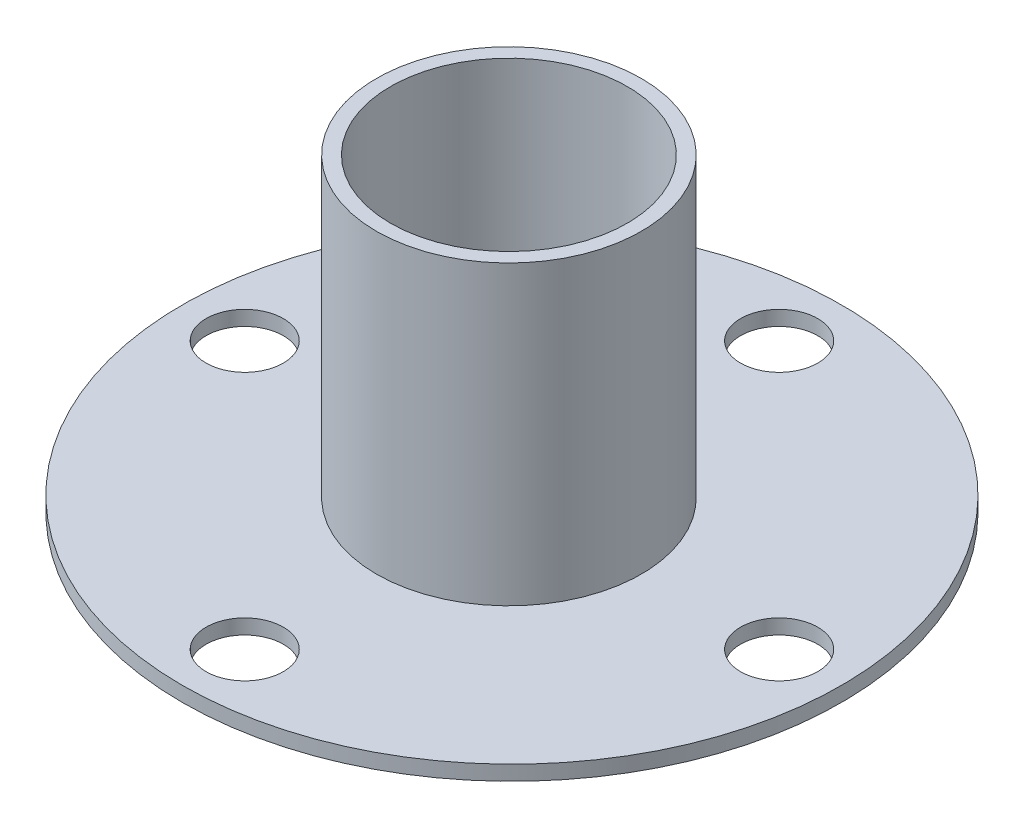
ISO-10303-21;
HEADER;
FILE_DESCRIPTION(('STEP AP214'),'2;1');
FILE_NAME('part.step','',(''),(''),'','','');
FILE_SCHEMA(('AUTOMOTIVE_DESIGN { 1 0 10303 214 1 1 1 1 }'));
ENDSEC;
DATA;
#1=APPLICATION_CONTEXT('core data for automotive mechanical design processes');
#2=APPLICATION_PROTOCOL_DEFINITION('international standard','automotive_design',2000,#1);
#3=PRODUCT_CONTEXT('',#1,'mechanical');
#4=PRODUCT('Part','Part','',(#3));
#5=PRODUCT_RELATED_PRODUCT_CATEGORY('part','',(#4));
#6=PRODUCT_DEFINITION_FORMATION('','',#4);
#7=PRODUCT_DEFINITION_CONTEXT('part definition',#1,'design');
#8=PRODUCT_DEFINITION('design','',#6,#7);
#9=PRODUCT_DEFINITION_SHAPE('','',#8);
#10=(LENGTH_UNIT() NAMED_UNIT(*) SI_UNIT(.MILLI.,.METRE.));
#11=(NAMED_UNIT(*) PLANE_ANGLE_UNIT() SI_UNIT($,.RADIAN.));
#12=(NAMED_UNIT(*) SI_UNIT($,.STERADIAN.) SOLID_ANGLE_UNIT());
#13=UNCERTAINTY_MEASURE_WITH_UNIT(LENGTH_MEASURE(1.E-05),#10,'distance_accuracy_value','');
#14=(GEOMETRIC_REPRESENTATION_CONTEXT(3) GLOBAL_UNCERTAINTY_ASSIGNED_CONTEXT((#13)) GLOBAL_UNIT_ASSIGNED_CONTEXT((#10,
#11,#12)) REPRESENTATION_CONTEXT('',''));
#15=CARTESIAN_POINT('',(0.,0.,0.));
#16=DIRECTION('',(0.,0.,1.));
#17=DIRECTION('',(1.,0.,0.));
#18=AXIS2_PLACEMENT_3D('',#15,#16,#17);
#19=CARTESIAN_POINT('',(6.52449997141957,44.,6.24759262427687));
#20=DIRECTION('',(0.,1.,0.));
#21=DIRECTION('',(0.,0.,1.));
#22=AXIS2_PLACEMENT_3D('',#19,#20,#21);
#23=PLANE('',#22);
#24=CARTESIAN_POINT('',(6.57427276019007,44.,6.50107907131314));
#25=DIRECTION('',(0.,1.,0.));
#26=DIRECTION('',(0.,0.,1.));
#27=AXIS2_PLACEMENT_3D('',#24,#25,#26);
#28=CIRCLE('',#27,6.91436631463015);
#29=CARTESIAN_POINT('',(6.57427276019007,44.,13.4154453859433));
#30=VERTEX_POINT('',#29);
#31=EDGE_CURVE('E68',#30,#30,#28,.T.);
#32=ORIENTED_EDGE('',*,*,#31,.T.);
#33=EDGE_LOOP('',(#32));
#34=FACE_BOUND('',#33,.T.);
#35=CARTESIAN_POINT('',(6.52449997141957,44.,-11.7524073757231));
#36=DIRECTION('',(0.,1.,0.));
#37=DIRECTION('',(0.,0.,1.));
#38=AXIS2_PLACEMENT_3D('',#35,#36,#37);
#39=CIRCLE('',#38,2.6);
#40=CARTESIAN_POINT('',(6.52449997141957,44.,-9.15240737572312));
#41=VERTEX_POINT('',#40);
#42=EDGE_CURVE('E61',#41,#41,#39,.T.);
#43=ORIENTED_EDGE('',*,*,#42,.T.);
#44=EDGE_LOOP('',(#43));
#45=FACE_BOUND('',#44,.T.);
#46=CARTESIAN_POINT('',(24.5244999714196,44.,6.24759262427687));
#47=DIRECTION('',(0.,1.,0.));
#48=DIRECTION('',(0.,0.,1.));
#49=AXIS2_PLACEMENT_3D('',#46,#47,#48);
#50=CIRCLE('',#49,2.6);
#51=CARTESIAN_POINT('',(24.5244999714196,44.,8.84759262427687));
#52=VERTEX_POINT('',#51);
#53=EDGE_CURVE('E80',#52,#52,#50,.T.);
#54=ORIENTED_EDGE('',*,*,#53,.T.);
#55=EDGE_LOOP('',(#54));
#56=FACE_BOUND('',#55,.T.);
#57=CARTESIAN_POINT('',(6.52449997141958,44.,24.2475926242769));
#58=DIRECTION('',(0.,1.,0.));
#59=DIRECTION('',(0.,0.,1.));
#60=AXIS2_PLACEMENT_3D('',#57,#58,#59);
#61=CIRCLE('',#60,2.6);
#62=CARTESIAN_POINT('',(6.52449997141958,44.,26.8475926242769));
#63=VERTEX_POINT('',#62);
#64=EDGE_CURVE('E72',#63,#63,#61,.T.);
#65=ORIENTED_EDGE('',*,*,#64,.T.);
#66=EDGE_LOOP('',(#65));
#67=FACE_BOUND('',#66,.T.);
#68=CARTESIAN_POINT('',(-11.4755000285804,44.,6.24759262427688));
#69=DIRECTION('',(0.,1.,0.));
#70=DIRECTION('',(0.,0.,1.));
#71=AXIS2_PLACEMENT_3D('',#68,#69,#70);
#72=CIRCLE('',#71,2.6);
#73=CARTESIAN_POINT('',(-11.4755000285804,44.,8.84759262427688));
#74=VERTEX_POINT('',#73);
#75=EDGE_CURVE('E63',#74,#74,#72,.T.);
#76=ORIENTED_EDGE('',*,*,#75,.T.);
#77=EDGE_LOOP('',(#76));
#78=FACE_BOUND('',#77,.T.);
#79=CARTESIAN_POINT('',(6.52449997141957,44.,6.24759262427687));
#80=DIRECTION('',(0.,1.,0.));
#81=DIRECTION('',(0.,0.,1.));
#82=AXIS2_PLACEMENT_3D('',#79,#80,#81);
#83=CIRCLE('',#82,22.2);
#84=CARTESIAN_POINT('',(6.52449997141957,44.,28.4475926242769));
#85=VERTEX_POINT('',#84);
#86=EDGE_CURVE('E11',#85,#85,#83,.T.);
#87=ORIENTED_EDGE('',*,*,#86,.F.);
#88=EDGE_LOOP('',(#87));
#89=FACE_BOUND('',#88,.T.);
#90=ADVANCED_FACE('F48',(#34,#45,#56,#67,#78,#89),#23,.F.);
#91=CARTESIAN_POINT('',(6.52449997141957,45.,6.24759262427687));
#92=DIRECTION('',(0.,1.,0.));
#93=DIRECTION('',(0.,0.,1.));
#94=AXIS2_PLACEMENT_3D('',#91,#92,#93);
#95=PLANE('',#94);
#96=CARTESIAN_POINT('',(6.57427276019007,45.,6.50107907131314));
#97=DIRECTION('',(0.,1.,0.));
#98=DIRECTION('',(0.,0.,1.));
#99=AXIS2_PLACEMENT_3D('',#96,#97,#98);
#100=CIRCLE('',#99,8.92257088604587);
#101=CARTESIAN_POINT('',(6.57427276019007,45.,15.423649957359));
#102=VERTEX_POINT('',#101);
#103=EDGE_CURVE('E103',#102,#102,#100,.T.);
#104=ORIENTED_EDGE('',*,*,#103,.F.);
#105=EDGE_LOOP('',(#104));
#106=FACE_BOUND('',#105,.T.);
#107=CARTESIAN_POINT('',(6.52449997141957,45.,-11.7524073757231));
#108=DIRECTION('',(0.,1.,0.));
#109=DIRECTION('',(0.,0.,1.));
#110=AXIS2_PLACEMENT_3D('',#107,#108,#109);
#111=CIRCLE('',#110,2.6);
#112=CARTESIAN_POINT('',(6.52449997141957,45.,-9.15240737572312));
#113=VERTEX_POINT('',#112);
#114=EDGE_CURVE('E88',#113,#113,#111,.T.);
#115=ORIENTED_EDGE('',*,*,#114,.F.);
#116=EDGE_LOOP('',(#115));
#117=FACE_BOUND('',#116,.T.);
#118=CARTESIAN_POINT('',(24.5244999714196,45.,6.24759262427687));
#119=DIRECTION('',(0.,1.,0.));
#120=DIRECTION('',(0.,0.,1.));
#121=AXIS2_PLACEMENT_3D('',#118,#119,#120);
#122=CIRCLE('',#121,2.6);
#123=CARTESIAN_POINT('',(24.5244999714196,45.,8.84759262427687));
#124=VERTEX_POINT('',#123);
#125=EDGE_CURVE('E84',#124,#124,#122,.T.);
#126=ORIENTED_EDGE('',*,*,#125,.F.);
#127=EDGE_LOOP('',(#126));
#128=FACE_BOUND('',#127,.T.);
#129=CARTESIAN_POINT('',(6.52449997141958,45.,24.2475926242769));
#130=DIRECTION('',(0.,1.,0.));
#131=DIRECTION('',(0.,0.,1.));
#132=AXIS2_PLACEMENT_3D('',#129,#130,#131);
#133=CIRCLE('',#132,2.6);
#134=CARTESIAN_POINT('',(6.52449997141958,45.,26.8475926242769));
#135=VERTEX_POINT('',#134);
#136=EDGE_CURVE('E76',#135,#135,#133,.T.);
#137=ORIENTED_EDGE('',*,*,#136,.F.);
#138=EDGE_LOOP('',(#137));
#139=FACE_BOUND('',#138,.T.);
#140=CARTESIAN_POINT('',(-11.4755000285804,45.,6.24759262427688));
#141=DIRECTION('',(0.,1.,0.));
#142=DIRECTION('',(0.,0.,1.));
#143=AXIS2_PLACEMENT_3D('',#140,#141,#142);
#144=CIRCLE('',#143,2.6);
#145=CARTESIAN_POINT('',(-11.4755000285804,45.,8.84759262427688));
#146=VERTEX_POINT('',#145);
#147=EDGE_CURVE('E67',#146,#146,#144,.T.);
#148=ORIENTED_EDGE('',*,*,#147,.F.);
#149=EDGE_LOOP('',(#148));
#150=FACE_BOUND('',#149,.T.);
#151=CARTESIAN_POINT('',(6.52449997141957,45.,6.24759262427687));
#152=DIRECTION('',(0.,1.,0.));
#153=DIRECTION('',(0.,0.,1.));
#154=AXIS2_PLACEMENT_3D('',#151,#152,#153);
#155=CIRCLE('',#154,22.2);
#156=CARTESIAN_POINT('',(6.52449997141957,45.,28.4475926242769));
#157=VERTEX_POINT('',#156);
#158=EDGE_CURVE('E52',#157,#157,#155,.T.);
#159=ORIENTED_EDGE('',*,*,#158,.T.);
#160=EDGE_LOOP('',(#159));
#161=FACE_BOUND('',#160,.T.);
#162=ADVANCED_FACE('F141',(#106,#117,#128,#139,#150,#161),#95,.T.);
#163=CARTESIAN_POINT('',(6.52449997141957,44.,6.24759262427687));
#164=DIRECTION('',(0.,1.,0.));
#165=DIRECTION('',(0.,0.,1.));
#166=AXIS2_PLACEMENT_3D('',#163,#164,#165);
#167=CYLINDRICAL_SURFACE('',#166,22.2);
#168=ORIENTED_EDGE('',*,*,#86,.T.);
#169=EDGE_LOOP('',(#168));
#170=FACE_BOUND('',#169,.T.);
#171=ORIENTED_EDGE('',*,*,#158,.F.);
#172=EDGE_LOOP('',(#171));
#173=FACE_BOUND('',#172,.T.);
#174=ADVANCED_FACE('F50',(#170,#173),#167,.T.);
#175=CARTESIAN_POINT('',(-11.4755000285804,44.,6.24759262427688));
#176=DIRECTION('',(0.,1.,0.));
#177=DIRECTION('',(0.,0.,1.));
#178=AXIS2_PLACEMENT_3D('',#175,#176,#177);
#179=CYLINDRICAL_SURFACE('',#178,2.6);
#180=ORIENTED_EDGE('',*,*,#75,.F.);
#181=EDGE_LOOP('',(#180));
#182=FACE_BOUND('',#181,.T.);
#183=ORIENTED_EDGE('',*,*,#147,.T.);
#184=EDGE_LOOP('',(#183));
#185=FACE_BOUND('',#184,.T.);
#186=ADVANCED_FACE('F155',(#182,#185),#179,.F.);
#187=CARTESIAN_POINT('',(6.52449997141958,44.,24.2475926242769));
#188=DIRECTION('',(0.,1.,0.));
#189=DIRECTION('',(0.,0.,1.));
#190=AXIS2_PLACEMENT_3D('',#187,#188,#189);
#191=CYLINDRICAL_SURFACE('',#190,2.6);
#192=ORIENTED_EDGE('',*,*,#64,.F.);
#193=EDGE_LOOP('',(#192));
#194=FACE_BOUND('',#193,.T.);
#195=ORIENTED_EDGE('',*,*,#136,.T.);
#196=EDGE_LOOP('',(#195));
#197=FACE_BOUND('',#196,.T.);
#198=ADVANCED_FACE('F159',(#194,#197),#191,.F.);
#199=CARTESIAN_POINT('',(24.5244999714196,44.,6.24759262427687));
#200=DIRECTION('',(0.,1.,0.));
#201=DIRECTION('',(0.,0.,1.));
#202=AXIS2_PLACEMENT_3D('',#199,#200,#201);
#203=CYLINDRICAL_SURFACE('',#202,2.6);
#204=ORIENTED_EDGE('',*,*,#53,.F.);
#205=EDGE_LOOP('',(#204));
#206=FACE_BOUND('',#205,.T.);
#207=ORIENTED_EDGE('',*,*,#125,.T.);
#208=EDGE_LOOP('',(#207));
#209=FACE_BOUND('',#208,.T.);
#210=ADVANCED_FACE('F171',(#206,#209),#203,.F.);
#211=CARTESIAN_POINT('',(6.52449997141957,44.,-11.7524073757231));
#212=DIRECTION('',(0.,1.,0.));
#213=DIRECTION('',(0.,0.,1.));
#214=AXIS2_PLACEMENT_3D('',#211,#212,#213);
#215=CYLINDRICAL_SURFACE('',#214,2.6);
#216=ORIENTED_EDGE('',*,*,#42,.F.);
#217=EDGE_LOOP('',(#216));
#218=FACE_BOUND('',#217,.T.);
#219=ORIENTED_EDGE('',*,*,#114,.T.);
#220=EDGE_LOOP('',(#219));
#221=FACE_BOUND('',#220,.T.);
#222=ADVANCED_FACE('F175',(#218,#221),#215,.F.);
#223=CARTESIAN_POINT('',(6.57427276019007,-4.99999821186066,6.50107907131314));
#224=DIRECTION('',(0.,1.,0.));
#225=DIRECTION('',(0.,0.,1.));
#226=AXIS2_PLACEMENT_3D('',#223,#224,#225);
#227=CYLINDRICAL_SURFACE('',#226,6.91436631463015);
#228=CARTESIAN_POINT('',(6.57427276019007,45.,6.50107907131314));
#229=DIRECTION('',(0.,1.,0.));
#230=DIRECTION('',(0.,0.,1.));
#231=AXIS2_PLACEMENT_3D('',#228,#229,#230);
#232=CIRCLE('',#231,6.91436631463015);
#233=CARTESIAN_POINT('',(6.57427276019007,45.,13.4154453859433));
#234=VERTEX_POINT('',#233);
#235=EDGE_CURVE('E99',#234,#234,#232,.F.);
#236=ORIENTED_EDGE('',*,*,#235,.F.);
#237=EDGE_LOOP('',(#236));
#238=FACE_BOUND('',#237,.T.);
#239=ORIENTED_EDGE('',*,*,#31,.F.);
#240=EDGE_LOOP('',(#239));
#241=FACE_BOUND('',#240,.T.);
#242=ADVANCED_FACE('F137',(#238,#241),#227,.F.);
#243=CARTESIAN_POINT('',(6.57427276019007,65.,6.50107907131314));
#244=DIRECTION('',(0.,-1.,0.));
#245=DIRECTION('',(0.,0.,-1.));
#246=AXIS2_PLACEMENT_3D('',#243,#244,#245);
#247=CYLINDRICAL_SURFACE('',#246,8.92257088604587);
#248=CARTESIAN_POINT('',(6.57427276019007,65.,6.50107907131314));
#249=DIRECTION('',(0.,1.,0.));
#250=DIRECTION('',(0.,0.,1.));
#251=AXIS2_PLACEMENT_3D('',#248,#249,#250);
#252=CIRCLE('',#251,8.92257088604587);
#253=CARTESIAN_POINT('',(6.57427276019007,65.,15.423649957359));
#254=VERTEX_POINT('',#253);
#255=EDGE_CURVE('E98',#254,#254,#252,.T.);
#256=ORIENTED_EDGE('',*,*,#255,.F.);
#257=EDGE_LOOP('',(#256));
#258=FACE_BOUND('',#257,.T.);
#259=ORIENTED_EDGE('',*,*,#103,.T.);
#260=EDGE_LOOP('',(#259));
#261=FACE_BOUND('',#260,.T.);
#262=ADVANCED_FACE('F131',(#258,#261),#247,.T.);
#263=CARTESIAN_POINT('',(6.57427276019007,65.,6.50107907131314));
#264=DIRECTION('',(0.,1.,0.));
#265=DIRECTION('',(0.,0.,1.));
#266=AXIS2_PLACEMENT_3D('',#263,#264,#265);
#267=PLANE('',#266);
#268=CARTESIAN_POINT('',(6.57427276019007,65.,6.50107907131314));
#269=DIRECTION('',(0.,1.,0.));
#270=DIRECTION('',(0.,0.,1.));
#271=AXIS2_PLACEMENT_3D('',#268,#269,#270);
#272=CIRCLE('',#271,7.97880080659274);
#273=CARTESIAN_POINT('',(6.57427276019007,65.,14.4798798779059));
#274=VERTEX_POINT('',#273);
#275=EDGE_CURVE('E111',#274,#274,#272,.T.);
#276=ORIENTED_EDGE('',*,*,#275,.F.);
#277=EDGE_LOOP('',(#276));
#278=FACE_BOUND('',#277,.T.);
#279=ORIENTED_EDGE('',*,*,#255,.T.);
#280=EDGE_LOOP('',(#279));
#281=FACE_BOUND('',#280,.T.);
#282=ADVANCED_FACE('F128',(#278,#281),#267,.T.);
#283=CARTESIAN_POINT('',(6.57427276019007,45.,6.50107907131314));
#284=DIRECTION('',(0.,1.,0.));
#285=DIRECTION('',(0.,0.,1.));
#286=AXIS2_PLACEMENT_3D('',#283,#284,#285);
#287=PLANE('',#286);
#288=CARTESIAN_POINT('',(6.57427276019007,45.,6.50107907131314));
#289=DIRECTION('',(0.,1.,0.));
#290=DIRECTION('',(0.,0.,1.));
#291=AXIS2_PLACEMENT_3D('',#288,#289,#290);
#292=CIRCLE('',#291,7.97880080659274);
#293=CARTESIAN_POINT('',(6.57427276019007,45.,14.4798798779059));
#294=VERTEX_POINT('',#293);
#295=EDGE_CURVE('E104',#294,#294,#292,.T.);
#296=ORIENTED_EDGE('',*,*,#295,.T.);
#297=EDGE_LOOP('',(#296));
#298=FACE_BOUND('',#297,.T.);
#299=ORIENTED_EDGE('',*,*,#235,.T.);
#300=EDGE_LOOP('',(#299));
#301=FACE_BOUND('',#300,.T.);
#302=ADVANCED_FACE('F119',(#298,#301),#287,.T.);
#303=CARTESIAN_POINT('',(6.57427276019007,45.,6.50107907131314));
#304=DIRECTION('',(0.,1.,0.));
#305=DIRECTION('',(0.,0.,1.));
#306=AXIS2_PLACEMENT_3D('',#303,#304,#305);
#307=CYLINDRICAL_SURFACE('',#306,7.97880080659274);
#308=ORIENTED_EDGE('',*,*,#295,.F.);
#309=EDGE_LOOP('',(#308));
#310=FACE_BOUND('',#309,.T.);
#311=ORIENTED_EDGE('',*,*,#275,.T.);
#312=EDGE_LOOP('',(#311));
#313=FACE_BOUND('',#312,.T.);
#314=ADVANCED_FACE('F122',(#310,#313),#307,.F.);
#315=CLOSED_SHELL('',(#90,#162,#174,#186,#198,#210,#222,#242,#262,#282,#302,#314));
#316=MANIFOLD_SOLID_BREP('B2',#315);
#317=ADVANCED_BREP_SHAPE_REPRESENTATION('',(#18,#316),#14);
#318=SHAPE_DEFINITION_REPRESENTATION(#9,#317);
ENDSEC;
END-ISO-10303-21;
